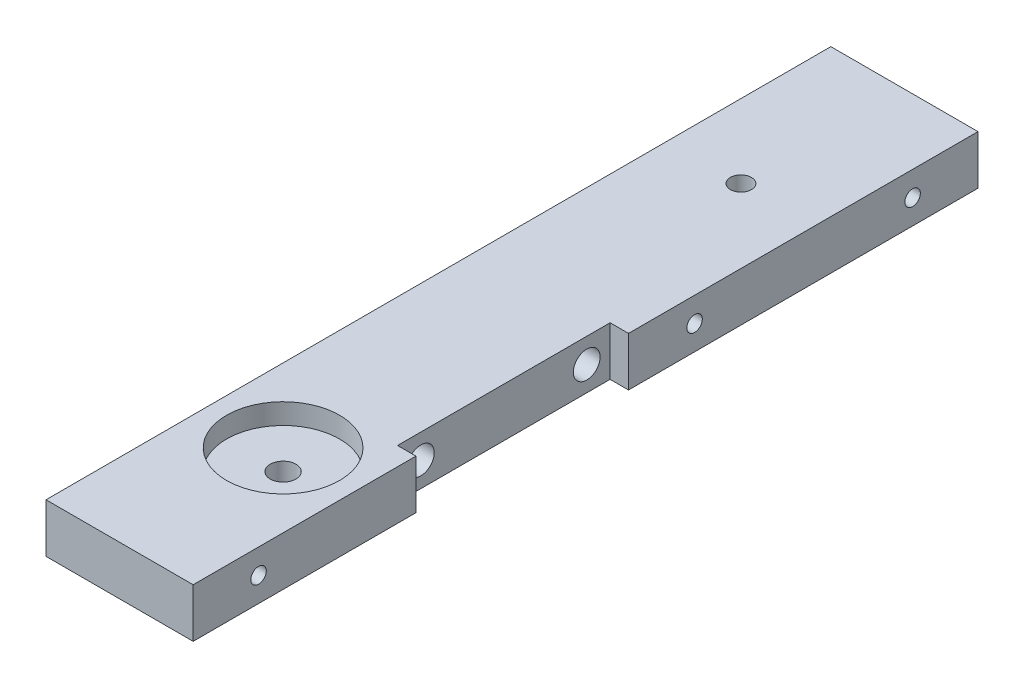
ISO-10303-21;
HEADER;
FILE_DESCRIPTION(('STEP AP214'),'2;1');
FILE_NAME('part.step','',(''),(''),'','','');
FILE_SCHEMA(('AUTOMOTIVE_DESIGN { 1 0 10303 214 1 1 1 1 }'));
ENDSEC;
DATA;
#1=APPLICATION_CONTEXT('core data for automotive mechanical design processes');
#2=APPLICATION_PROTOCOL_DEFINITION('international standard','automotive_design',2000,#1);
#3=PRODUCT_CONTEXT('',#1,'mechanical');
#4=PRODUCT('Part','Part','',(#3));
#5=PRODUCT_RELATED_PRODUCT_CATEGORY('part','',(#4));
#6=PRODUCT_DEFINITION_FORMATION('','',#4);
#7=PRODUCT_DEFINITION_CONTEXT('part definition',#1,'design');
#8=PRODUCT_DEFINITION('design','',#6,#7);
#9=PRODUCT_DEFINITION_SHAPE('','',#8);
#10=(LENGTH_UNIT() NAMED_UNIT(*) SI_UNIT(.MILLI.,.METRE.));
#11=(NAMED_UNIT(*) PLANE_ANGLE_UNIT() SI_UNIT($,.RADIAN.));
#12=(NAMED_UNIT(*) SI_UNIT($,.STERADIAN.) SOLID_ANGLE_UNIT());
#13=UNCERTAINTY_MEASURE_WITH_UNIT(LENGTH_MEASURE(1.E-05),#10,'distance_accuracy_value','');
#14=(GEOMETRIC_REPRESENTATION_CONTEXT(3) GLOBAL_UNCERTAINTY_ASSIGNED_CONTEXT((#13)) GLOBAL_UNIT_ASSIGNED_CONTEXT((#10,
#11,#12)) REPRESENTATION_CONTEXT('',''));
#15=CARTESIAN_POINT('',(0.,0.,0.));
#16=DIRECTION('',(0.,0.,1.));
#17=DIRECTION('',(1.,0.,0.));
#18=AXIS2_PLACEMENT_3D('',#15,#16,#17);
#19=CARTESIAN_POINT('',(28.575,9.525,-152.4));
#20=DIRECTION('',(-1.,0.,0.));
#21=DIRECTION('',(0.,0.,1.));
#22=AXIS2_PLACEMENT_3D('',#19,#20,#21);
#23=PLANE('',#22);
#24=CARTESIAN_POINT('',(28.575,4.7625,-12.7));
#25=DIRECTION('',(-1.,0.,0.));
#26=DIRECTION('',(0.,0.,1.));
#27=AXIS2_PLACEMENT_3D('',#24,#25,#26);
#28=CIRCLE('',#27,1.49999999999999);
#29=CARTESIAN_POINT('',(28.575,4.7625,-11.2));
#30=VERTEX_POINT('',#29);
#31=EDGE_CURVE('E49',#30,#30,#28,.T.);
#32=ORIENTED_EDGE('',*,*,#31,.T.);
#33=EDGE_LOOP('',(#32));
#34=FACE_BOUND('',#33,.T.);
#35=DIRECTION('',(0.,1.,0.));
#36=VECTOR('',#35,1.);
#37=CARTESIAN_POINT('',(28.575,9.525,-43.255));
#38=LINE('',#37,#36);
#39=CARTESIAN_POINT('',(28.575,0.,-43.255));
#40=VERTEX_POINT('',#39);
#41=CARTESIAN_POINT('',(28.575,9.525,-43.255));
#42=VERTEX_POINT('',#41);
#43=EDGE_CURVE('E137',#40,#42,#38,.T.);
#44=ORIENTED_EDGE('',*,*,#43,.T.);
#45=DIRECTION('',(0.,0.,-1.));
#46=VECTOR('',#45,1.);
#47=CARTESIAN_POINT('',(28.575,9.525,-152.4));
#48=LINE('',#47,#46);
#49=CARTESIAN_POINT('',(28.575,9.525,0.));
#50=VERTEX_POINT('',#49);
#51=EDGE_CURVE('E94',#50,#42,#48,.T.);
#52=ORIENTED_EDGE('',*,*,#51,.F.);
#53=DIRECTION('',(0.,-1.,0.));
#54=VECTOR('',#53,1.);
#55=CARTESIAN_POINT('',(28.575,9.525,0.));
#56=LINE('',#55,#54);
#57=CARTESIAN_POINT('',(28.575,0.,0.));
#58=VERTEX_POINT('',#57);
#59=EDGE_CURVE('E160',#50,#58,#56,.T.);
#60=ORIENTED_EDGE('',*,*,#59,.T.);
#61=DIRECTION('',(0.,0.,-1.));
#62=VECTOR('',#61,1.);
#63=CARTESIAN_POINT('',(28.575,0.,-152.4));
#64=LINE('',#63,#62);
#65=EDGE_CURVE('E142',#58,#40,#64,.T.);
#66=ORIENTED_EDGE('',*,*,#65,.T.);
#67=EDGE_LOOP('',(#44,#52,#60,#66));
#68=FACE_BOUND('',#67,.T.);
#69=ADVANCED_FACE('F40',(#34,#68),#23,.F.);
#70=CARTESIAN_POINT('',(28.575,4.7625,-139.7));
#71=DIRECTION('',(-1.,0.,0.));
#72=DIRECTION('',(0.,0.,1.));
#73=AXIS2_PLACEMENT_3D('',#70,#71,#72);
#74=CIRCLE('',#73,1.49999999999999);
#75=CARTESIAN_POINT('',(28.575,4.7625,-138.2));
#76=VERTEX_POINT('',#75);
#77=EDGE_CURVE('E147',#76,#76,#74,.T.);
#78=ORIENTED_EDGE('',*,*,#77,.T.);
#79=EDGE_LOOP('',(#78));
#80=FACE_BOUND('',#79,.T.);
#81=CARTESIAN_POINT('',(28.575,4.7625,-97.3666666666667));
#82=DIRECTION('',(-1.,0.,0.));
#83=DIRECTION('',(0.,0.,1.));
#84=AXIS2_PLACEMENT_3D('',#81,#82,#83);
#85=CIRCLE('',#84,1.49999999999999);
#86=CARTESIAN_POINT('',(28.575,4.7625,-95.8666666666667));
#87=VERTEX_POINT('',#86);
#88=EDGE_CURVE('E225',#87,#87,#85,.T.);
#89=ORIENTED_EDGE('',*,*,#88,.T.);
#90=EDGE_LOOP('',(#89));
#91=FACE_BOUND('',#90,.T.);
#92=DIRECTION('',(0.,-1.,0.));
#93=VECTOR('',#92,1.);
#94=CARTESIAN_POINT('',(28.575,9.525,-84.535));
#95=LINE('',#94,#93);
#96=CARTESIAN_POINT('',(28.575,9.525,-84.535));
#97=VERTEX_POINT('',#96);
#98=CARTESIAN_POINT('',(28.575,0.,-84.535));
#99=VERTEX_POINT('',#98);
#100=EDGE_CURVE('E121',#97,#99,#95,.T.);
#101=ORIENTED_EDGE('',*,*,#100,.T.);
#102=CARTESIAN_POINT('',(28.575,0.,-152.4));
#103=VERTEX_POINT('',#102);
#104=EDGE_CURVE('E134',#99,#103,#64,.T.);
#105=ORIENTED_EDGE('',*,*,#104,.T.);
#106=DIRECTION('',(0.,-1.,0.));
#107=VECTOR('',#106,1.);
#108=CARTESIAN_POINT('',(28.575,9.525,-152.4));
#109=LINE('',#108,#107);
#110=CARTESIAN_POINT('',(28.575,9.525,-152.4));
#111=VERTEX_POINT('',#110);
#112=EDGE_CURVE('E158',#111,#103,#109,.T.);
#113=ORIENTED_EDGE('',*,*,#112,.F.);
#114=EDGE_CURVE('E136',#97,#111,#48,.T.);
#115=ORIENTED_EDGE('',*,*,#114,.F.);
#116=EDGE_LOOP('',(#101,#105,#113,#115));
#117=FACE_BOUND('',#116,.T.);
#118=ADVANCED_FACE('F132',(#80,#91,#117),#23,.F.);
#119=CARTESIAN_POINT('',(0.,9.525,0.));
#120=DIRECTION('',(0.,-1.,0.));
#121=DIRECTION('',(0.,0.,-1.));
#122=AXIS2_PLACEMENT_3D('',#119,#120,#121);
#123=PLANE('',#122);
#124=CARTESIAN_POINT('',(14.2875,9.525,-120.65));
#125=DIRECTION('',(0.,1.,0.));
#126=DIRECTION('',(0.,0.,1.));
#127=AXIS2_PLACEMENT_3D('',#124,#125,#126);
#128=CIRCLE('',#127,2.05);
#129=CARTESIAN_POINT('',(14.2875,9.525,-118.6));
#130=VERTEX_POINT('',#129);
#131=EDGE_CURVE('E229',#130,#130,#128,.T.);
#132=ORIENTED_EDGE('',*,*,#131,.F.);
#133=EDGE_LOOP('',(#132));
#134=FACE_BOUND('',#133,.T.);
#135=CARTESIAN_POINT('',(14.2875,9.525,-31.75));
#136=DIRECTION('',(0.,1.,0.));
#137=DIRECTION('',(0.,0.,1.));
#138=AXIS2_PLACEMENT_3D('',#135,#136,#137);
#139=CIRCLE('',#138,10.975);
#140=CARTESIAN_POINT('',(14.2875,9.525,-20.775));
#141=VERTEX_POINT('',#140);
#142=EDGE_CURVE('E235',#141,#141,#139,.T.);
#143=ORIENTED_EDGE('',*,*,#142,.F.);
#144=EDGE_LOOP('',(#143));
#145=FACE_BOUND('',#144,.T.);
#146=DIRECTION('',(1.,0.,0.));
#147=VECTOR('',#146,1.);
#148=CARTESIAN_POINT('',(-42.3646553744982,9.525,-43.255));
#149=LINE('',#148,#147);
#150=CARTESIAN_POINT('',(25.,9.525,-43.255));
#151=VERTEX_POINT('',#150);
#152=EDGE_CURVE('E211',#151,#42,#149,.T.);
#153=ORIENTED_EDGE('',*,*,#152,.F.);
#154=DIRECTION('',(0.,0.,1.));
#155=VECTOR('',#154,1.);
#156=CARTESIAN_POINT('',(25.,9.525,-84.535));
#157=LINE('',#156,#155);
#158=CARTESIAN_POINT('',(25.,9.525,-84.535));
#159=VERTEX_POINT('',#158);
#160=EDGE_CURVE('E127',#159,#151,#157,.T.);
#161=ORIENTED_EDGE('',*,*,#160,.F.);
#162=DIRECTION('',(1.,0.,0.));
#163=VECTOR('',#162,1.);
#164=CARTESIAN_POINT('',(-42.3646553744982,9.525,-84.535));
#165=LINE('',#164,#163);
#166=EDGE_CURVE('E207',#159,#97,#165,.T.);
#167=ORIENTED_EDGE('',*,*,#166,.T.);
#168=ORIENTED_EDGE('',*,*,#114,.T.);
#169=DIRECTION('',(-1.,0.,0.));
#170=VECTOR('',#169,1.);
#171=CARTESIAN_POINT('',(0.,9.525,-152.4));
#172=LINE('',#171,#170);
#173=CARTESIAN_POINT('',(0.,9.525,-152.4));
#174=VERTEX_POINT('',#173);
#175=EDGE_CURVE('E212',#111,#174,#172,.T.);
#176=ORIENTED_EDGE('',*,*,#175,.T.);
#177=DIRECTION('',(0.,0.,1.));
#178=VECTOR('',#177,1.);
#179=CARTESIAN_POINT('',(0.,9.525,0.));
#180=LINE('',#179,#178);
#181=CARTESIAN_POINT('',(0.,9.525,0.));
#182=VERTEX_POINT('',#181);
#183=EDGE_CURVE('E65',#174,#182,#180,.T.);
#184=ORIENTED_EDGE('',*,*,#183,.T.);
#185=DIRECTION('',(1.,0.,0.));
#186=VECTOR('',#185,1.);
#187=CARTESIAN_POINT('',(28.575,9.525,0.));
#188=LINE('',#187,#186);
#189=EDGE_CURVE('E153',#182,#50,#188,.T.);
#190=ORIENTED_EDGE('',*,*,#189,.T.);
#191=ORIENTED_EDGE('',*,*,#51,.T.);
#192=EDGE_LOOP('',(#153,#161,#167,#168,#176,#184,#190,#191));
#193=FACE_BOUND('',#192,.T.);
#194=ADVANCED_FACE('F196',(#134,#145,#193),#123,.F.);
#195=CARTESIAN_POINT('',(0.,0.,0.));
#196=DIRECTION('',(0.,-1.,0.));
#197=DIRECTION('',(0.,0.,-1.));
#198=AXIS2_PLACEMENT_3D('',#195,#196,#197);
#199=PLANE('',#198);
#200=CARTESIAN_POINT('',(14.2875,0.,-31.75));
#201=DIRECTION('',(0.,1.,0.));
#202=DIRECTION('',(0.,0.,1.));
#203=AXIS2_PLACEMENT_3D('',#200,#201,#202);
#204=CIRCLE('',#203,2.5);
#205=CARTESIAN_POINT('',(14.2875,0.,-29.25));
#206=VERTEX_POINT('',#205);
#207=EDGE_CURVE('E238',#206,#206,#204,.T.);
#208=ORIENTED_EDGE('',*,*,#207,.T.);
#209=EDGE_LOOP('',(#208));
#210=FACE_BOUND('',#209,.T.);
#211=CARTESIAN_POINT('',(14.2875,0.,-120.65));
#212=DIRECTION('',(0.,1.,0.));
#213=DIRECTION('',(0.,0.,1.));
#214=AXIS2_PLACEMENT_3D('',#211,#212,#213);
#215=CIRCLE('',#214,2.05);
#216=CARTESIAN_POINT('',(14.2875,0.,-118.6));
#217=VERTEX_POINT('',#216);
#218=EDGE_CURVE('E228',#217,#217,#215,.T.);
#219=ORIENTED_EDGE('',*,*,#218,.T.);
#220=EDGE_LOOP('',(#219));
#221=FACE_BOUND('',#220,.T.);
#222=DIRECTION('',(0.,0.,-1.));
#223=VECTOR('',#222,1.);
#224=CARTESIAN_POINT('',(25.,0.,-84.535));
#225=LINE('',#224,#223);
#226=CARTESIAN_POINT('',(25.,0.,-43.255));
#227=VERTEX_POINT('',#226);
#228=CARTESIAN_POINT('',(25.,0.,-84.535));
#229=VERTEX_POINT('',#228);
#230=EDGE_CURVE('E260',#227,#229,#225,.T.);
#231=ORIENTED_EDGE('',*,*,#230,.F.);
#232=DIRECTION('',(1.,0.,0.));
#233=VECTOR('',#232,1.);
#234=CARTESIAN_POINT('',(-42.3646553744982,0.,-43.255));
#235=LINE('',#234,#233);
#236=EDGE_CURVE('E128',#227,#40,#235,.T.);
#237=ORIENTED_EDGE('',*,*,#236,.T.);
#238=ORIENTED_EDGE('',*,*,#65,.F.);
#239=DIRECTION('',(1.,0.,0.));
#240=VECTOR('',#239,1.);
#241=CARTESIAN_POINT('',(28.575,0.,0.));
#242=LINE('',#241,#240);
#243=CARTESIAN_POINT('',(0.,0.,0.));
#244=VERTEX_POINT('',#243);
#245=EDGE_CURVE('E143',#244,#58,#242,.T.);
#246=ORIENTED_EDGE('',*,*,#245,.F.);
#247=DIRECTION('',(0.,0.,1.));
#248=VECTOR('',#247,1.);
#249=CARTESIAN_POINT('',(0.,0.,0.));
#250=LINE('',#249,#248);
#251=CARTESIAN_POINT('',(0.,0.,-152.4));
#252=VERTEX_POINT('',#251);
#253=EDGE_CURVE('E86',#252,#244,#250,.T.);
#254=ORIENTED_EDGE('',*,*,#253,.F.);
#255=DIRECTION('',(-1.,0.,0.));
#256=VECTOR('',#255,1.);
#257=CARTESIAN_POINT('',(0.,0.,-152.4));
#258=LINE('',#257,#256);
#259=EDGE_CURVE('E141',#103,#252,#258,.T.);
#260=ORIENTED_EDGE('',*,*,#259,.F.);
#261=ORIENTED_EDGE('',*,*,#104,.F.);
#262=DIRECTION('',(1.,0.,0.));
#263=VECTOR('',#262,1.);
#264=CARTESIAN_POINT('',(-42.3646553744982,0.,-84.535));
#265=LINE('',#264,#263);
#266=EDGE_CURVE('E117',#229,#99,#265,.T.);
#267=ORIENTED_EDGE('',*,*,#266,.F.);
#268=EDGE_LOOP('',(#231,#237,#238,#246,#254,#260,#261,#267));
#269=FACE_BOUND('',#268,.T.);
#270=ADVANCED_FACE('F140',(#210,#221,#269),#199,.T.);
#271=CARTESIAN_POINT('',(28.575,4.7625,-47.79));
#272=DIRECTION('',(-1.,0.,0.));
#273=DIRECTION('',(0.,0.,1.));
#274=AXIS2_PLACEMENT_3D('',#271,#272,#273);
#275=CYLINDRICAL_SURFACE('',#274,2.6);
#276=CARTESIAN_POINT('',(0.,4.7625,-47.79));
#277=DIRECTION('',(-1.,0.,0.));
#278=DIRECTION('',(0.,0.,1.));
#279=AXIS2_PLACEMENT_3D('',#276,#277,#278);
#280=CIRCLE('',#279,2.6);
#281=CARTESIAN_POINT('',(0.,4.7625,-45.19));
#282=VERTEX_POINT('',#281);
#283=EDGE_CURVE('E247',#282,#282,#280,.T.);
#284=ORIENTED_EDGE('',*,*,#283,.T.);
#285=EDGE_LOOP('',(#284));
#286=FACE_BOUND('',#285,.T.);
#287=CARTESIAN_POINT('',(25.,4.7625,-47.79));
#288=DIRECTION('',(1.,0.,0.));
#289=DIRECTION('',(0.,0.,-1.));
#290=AXIS2_PLACEMENT_3D('',#287,#288,#289);
#291=CIRCLE('',#290,2.6);
#292=CARTESIAN_POINT('',(25.,4.7625,-50.39));
#293=VERTEX_POINT('',#292);
#294=EDGE_CURVE('E250',#293,#293,#291,.F.);
#295=ORIENTED_EDGE('',*,*,#294,.F.);
#296=EDGE_LOOP('',(#295));
#297=FACE_BOUND('',#296,.T.);
#298=ADVANCED_FACE('F275',(#286,#297),#275,.F.);
#299=CARTESIAN_POINT('',(28.575,4.7625,-80.));
#300=DIRECTION('',(-1.,0.,0.));
#301=DIRECTION('',(0.,0.,1.));
#302=AXIS2_PLACEMENT_3D('',#299,#300,#301);
#303=CYLINDRICAL_SURFACE('',#302,2.6);
#304=CARTESIAN_POINT('',(0.,4.7625,-80.));
#305=DIRECTION('',(-1.,0.,0.));
#306=DIRECTION('',(0.,0.,1.));
#307=AXIS2_PLACEMENT_3D('',#304,#305,#306);
#308=CIRCLE('',#307,2.6);
#309=CARTESIAN_POINT('',(0.,4.7625,-77.4));
#310=VERTEX_POINT('',#309);
#311=EDGE_CURVE('E244',#310,#310,#308,.T.);
#312=ORIENTED_EDGE('',*,*,#311,.T.);
#313=EDGE_LOOP('',(#312));
#314=FACE_BOUND('',#313,.T.);
#315=CARTESIAN_POINT('',(25.,4.7625,-80.));
#316=DIRECTION('',(1.,0.,0.));
#317=DIRECTION('',(0.,0.,-1.));
#318=AXIS2_PLACEMENT_3D('',#315,#316,#317);
#319=CIRCLE('',#318,2.6);
#320=CARTESIAN_POINT('',(25.,4.7625,-82.6));
#321=VERTEX_POINT('',#320);
#322=EDGE_CURVE('E44',#321,#321,#319,.F.);
#323=ORIENTED_EDGE('',*,*,#322,.F.);
#324=EDGE_LOOP('',(#323));
#325=FACE_BOUND('',#324,.T.);
#326=ADVANCED_FACE('F169',(#314,#325),#303,.F.);
#327=CARTESIAN_POINT('',(0.,4.7625,-12.7));
#328=DIRECTION('',(-1.,0.,0.));
#329=DIRECTION('',(0.,0.,1.));
#330=AXIS2_PLACEMENT_3D('',#327,#328,#329);
#331=CYLINDRICAL_SURFACE('',#330,1.5);
#332=ORIENTED_EDGE('',*,*,#31,.F.);
#333=EDGE_LOOP('',(#332));
#334=FACE_BOUND('',#333,.T.);
#335=CARTESIAN_POINT('',(0.,4.7625,-12.7));
#336=DIRECTION('',(-1.,0.,0.));
#337=DIRECTION('',(0.,0.,1.));
#338=AXIS2_PLACEMENT_3D('',#335,#336,#337);
#339=CIRCLE('',#338,1.5);
#340=CARTESIAN_POINT('',(0.,4.7625,-11.2));
#341=VERTEX_POINT('',#340);
#342=EDGE_CURVE('E12',#341,#341,#339,.T.);
#343=ORIENTED_EDGE('',*,*,#342,.T.);
#344=EDGE_LOOP('',(#343));
#345=FACE_BOUND('',#344,.T.);
#346=ADVANCED_FACE('F42',(#334,#345),#331,.F.);
#347=CARTESIAN_POINT('',(28.575,9.525,0.));
#348=DIRECTION('',(0.,0.,-1.));
#349=DIRECTION('',(-1.,0.,0.));
#350=AXIS2_PLACEMENT_3D('',#347,#348,#349);
#351=PLANE('',#350);
#352=ORIENTED_EDGE('',*,*,#245,.T.);
#353=ORIENTED_EDGE('',*,*,#59,.F.);
#354=ORIENTED_EDGE('',*,*,#189,.F.);
#355=DIRECTION('',(0.,-1.,0.));
#356=VECTOR('',#355,1.);
#357=CARTESIAN_POINT('',(0.,9.525,0.));
#358=LINE('',#357,#356);
#359=EDGE_CURVE('E154',#182,#244,#358,.T.);
#360=ORIENTED_EDGE('',*,*,#359,.T.);
#361=EDGE_LOOP('',(#352,#353,#354,#360));
#362=FACE_BOUND('',#361,.T.);
#363=ADVANCED_FACE('F168',(#362),#351,.F.);
#364=CARTESIAN_POINT('',(0.,9.525,-152.4));
#365=DIRECTION('',(0.,0.,1.));
#366=DIRECTION('',(1.,0.,0.));
#367=AXIS2_PLACEMENT_3D('',#364,#365,#366);
#368=PLANE('',#367);
#369=ORIENTED_EDGE('',*,*,#259,.T.);
#370=DIRECTION('',(0.,-1.,0.));
#371=VECTOR('',#370,1.);
#372=CARTESIAN_POINT('',(0.,9.525,-152.4));
#373=LINE('',#372,#371);
#374=EDGE_CURVE('E156',#174,#252,#373,.T.);
#375=ORIENTED_EDGE('',*,*,#374,.F.);
#376=ORIENTED_EDGE('',*,*,#175,.F.);
#377=ORIENTED_EDGE('',*,*,#112,.T.);
#378=EDGE_LOOP('',(#369,#375,#376,#377));
#379=FACE_BOUND('',#378,.T.);
#380=ADVANCED_FACE('F175',(#379),#368,.F.);
#381=CARTESIAN_POINT('',(0.,9.525,0.));
#382=DIRECTION('',(1.,0.,0.));
#383=DIRECTION('',(0.,0.,-1.));
#384=AXIS2_PLACEMENT_3D('',#381,#382,#383);
#385=PLANE('',#384);
#386=ORIENTED_EDGE('',*,*,#311,.F.);
#387=EDGE_LOOP('',(#386));
#388=FACE_BOUND('',#387,.T.);
#389=ORIENTED_EDGE('',*,*,#283,.F.);
#390=EDGE_LOOP('',(#389));
#391=FACE_BOUND('',#390,.T.);
#392=CARTESIAN_POINT('',(0.,4.7625,-97.3666666666667));
#393=DIRECTION('',(-1.,0.,0.));
#394=DIRECTION('',(0.,0.,1.));
#395=AXIS2_PLACEMENT_3D('',#392,#393,#394);
#396=CIRCLE('',#395,1.5);
#397=CARTESIAN_POINT('',(0.,4.7625,-95.8666666666667));
#398=VERTEX_POINT('',#397);
#399=EDGE_CURVE('E222',#398,#398,#396,.T.);
#400=ORIENTED_EDGE('',*,*,#399,.F.);
#401=EDGE_LOOP('',(#400));
#402=FACE_BOUND('',#401,.T.);
#403=CARTESIAN_POINT('',(0.,4.7625,-139.7));
#404=DIRECTION('',(-1.,0.,0.));
#405=DIRECTION('',(0.,0.,1.));
#406=AXIS2_PLACEMENT_3D('',#403,#404,#405);
#407=CIRCLE('',#406,1.5);
#408=CARTESIAN_POINT('',(0.,4.7625,-138.2));
#409=VERTEX_POINT('',#408);
#410=EDGE_CURVE('E219',#409,#409,#407,.T.);
#411=ORIENTED_EDGE('',*,*,#410,.F.);
#412=EDGE_LOOP('',(#411));
#413=FACE_BOUND('',#412,.T.);
#414=ORIENTED_EDGE('',*,*,#253,.T.);
#415=ORIENTED_EDGE('',*,*,#359,.F.);
#416=ORIENTED_EDGE('',*,*,#183,.F.);
#417=ORIENTED_EDGE('',*,*,#374,.T.);
#418=EDGE_LOOP('',(#414,#415,#416,#417));
#419=FACE_BOUND('',#418,.T.);
#420=ORIENTED_EDGE('',*,*,#342,.F.);
#421=EDGE_LOOP('',(#420));
#422=FACE_BOUND('',#421,.T.);
#423=ADVANCED_FACE('F172',(#388,#391,#402,#413,#419,#422),#385,.F.);
#424=CARTESIAN_POINT('',(0.,4.7625,-139.7));
#425=DIRECTION('',(-1.,0.,0.));
#426=DIRECTION('',(0.,0.,1.));
#427=AXIS2_PLACEMENT_3D('',#424,#425,#426);
#428=CYLINDRICAL_SURFACE('',#427,1.5);
#429=ORIENTED_EDGE('',*,*,#77,.F.);
#430=EDGE_LOOP('',(#429));
#431=FACE_BOUND('',#430,.T.);
#432=ORIENTED_EDGE('',*,*,#410,.T.);
#433=EDGE_LOOP('',(#432));
#434=FACE_BOUND('',#433,.T.);
#435=ADVANCED_FACE('F174',(#431,#434),#428,.F.);
#436=CARTESIAN_POINT('',(0.,4.7625,-97.3666666666667));
#437=DIRECTION('',(-1.,0.,0.));
#438=DIRECTION('',(0.,0.,1.));
#439=AXIS2_PLACEMENT_3D('',#436,#437,#438);
#440=CYLINDRICAL_SURFACE('',#439,1.5);
#441=ORIENTED_EDGE('',*,*,#88,.F.);
#442=EDGE_LOOP('',(#441));
#443=FACE_BOUND('',#442,.T.);
#444=ORIENTED_EDGE('',*,*,#399,.T.);
#445=EDGE_LOOP('',(#444));
#446=FACE_BOUND('',#445,.T.);
#447=ADVANCED_FACE('F183',(#443,#446),#440,.F.);
#448=CARTESIAN_POINT('',(14.2875,0.,-120.65));
#449=DIRECTION('',(0.,1.,0.));
#450=DIRECTION('',(0.,0.,1.));
#451=AXIS2_PLACEMENT_3D('',#448,#449,#450);
#452=CYLINDRICAL_SURFACE('',#451,2.05);
#453=CARTESIAN_POINT('',(14.2875,0.,-118.6));
#454=CARTESIAN_POINT('',(14.2875,0.0992187499999999,-118.6));
#455=CARTESIAN_POINT('',(14.2875,0.1984375,-118.6));
#456=CARTESIAN_POINT('',(14.2875,0.396875,-118.6));
#457=CARTESIAN_POINT('',(14.2875,0.49609375,-118.6));
#458=CARTESIAN_POINT('',(14.2875,0.69453125,-118.6));
#459=CARTESIAN_POINT('',(14.2875,0.79375,-118.6));
#460=CARTESIAN_POINT('',(14.2875,0.9921875,-118.6));
#461=CARTESIAN_POINT('',(14.2875,1.09140625,-118.6));
#462=CARTESIAN_POINT('',(14.2875,1.28984375,-118.6));
#463=CARTESIAN_POINT('',(14.2875,1.3890625,-118.6));
#464=CARTESIAN_POINT('',(14.2875,1.5875,-118.6));
#465=CARTESIAN_POINT('',(14.2875,1.68671875,-118.6));
#466=CARTESIAN_POINT('',(14.2875,1.88515625,-118.6));
#467=CARTESIAN_POINT('',(14.2875,1.984375,-118.6));
#468=CARTESIAN_POINT('',(14.2875,2.1828125,-118.6));
#469=CARTESIAN_POINT('',(14.2875,2.28203125,-118.6));
#470=CARTESIAN_POINT('',(14.2875,2.48046875,-118.6));
#471=CARTESIAN_POINT('',(14.2875,2.5796875,-118.6));
#472=CARTESIAN_POINT('',(14.2875,2.778125,-118.6));
#473=CARTESIAN_POINT('',(14.2875,2.87734375,-118.6));
#474=CARTESIAN_POINT('',(14.2875,3.07578125,-118.6));
#475=CARTESIAN_POINT('',(14.2875,3.175,-118.6));
#476=CARTESIAN_POINT('',(14.2875,3.3734375,-118.6));
#477=CARTESIAN_POINT('',(14.2875,3.47265625,-118.6));
#478=CARTESIAN_POINT('',(14.2875,3.67109375,-118.6));
#479=CARTESIAN_POINT('',(14.2875,3.7703125,-118.6));
#480=CARTESIAN_POINT('',(14.2875,3.96875,-118.6));
#481=CARTESIAN_POINT('',(14.2875,4.06796875,-118.6));
#482=CARTESIAN_POINT('',(14.2875,4.26640625,-118.6));
#483=CARTESIAN_POINT('',(14.2875,4.365625,-118.6));
#484=CARTESIAN_POINT('',(14.2875,4.5640625,-118.6));
#485=CARTESIAN_POINT('',(14.2875,4.66328125,-118.6));
#486=CARTESIAN_POINT('',(14.2875,4.86171875,-118.6));
#487=CARTESIAN_POINT('',(14.2875,4.9609375,-118.6));
#488=CARTESIAN_POINT('',(14.2875,5.159375,-118.6));
#489=CARTESIAN_POINT('',(14.2875,5.25859375,-118.6));
#490=CARTESIAN_POINT('',(14.2875,5.45703125,-118.6));
#491=CARTESIAN_POINT('',(14.2875,5.55625,-118.6));
#492=CARTESIAN_POINT('',(14.2875,5.7546875,-118.6));
#493=CARTESIAN_POINT('',(14.2875,5.85390625,-118.6));
#494=CARTESIAN_POINT('',(14.2875,6.05234375,-118.6));
#495=CARTESIAN_POINT('',(14.2875,6.1515625,-118.6));
#496=CARTESIAN_POINT('',(14.2875,6.35,-118.6));
#497=CARTESIAN_POINT('',(14.2875,6.44921875,-118.6));
#498=CARTESIAN_POINT('',(14.2875,6.64765625,-118.6));
#499=CARTESIAN_POINT('',(14.2875,6.746875,-118.6));
#500=CARTESIAN_POINT('',(14.2875,6.9453125,-118.6));
#501=CARTESIAN_POINT('',(14.2875,7.04453125,-118.6));
#502=CARTESIAN_POINT('',(14.2875,7.24296875,-118.6));
#503=CARTESIAN_POINT('',(14.2875,7.3421875,-118.6));
#504=CARTESIAN_POINT('',(14.2875,7.540625,-118.6));
#505=CARTESIAN_POINT('',(14.2875,7.63984375,-118.6));
#506=CARTESIAN_POINT('',(14.2875,7.83828125,-118.6));
#507=CARTESIAN_POINT('',(14.2875,7.9375,-118.6));
#508=CARTESIAN_POINT('',(14.2875,8.1359375,-118.6));
#509=CARTESIAN_POINT('',(14.2875,8.23515625,-118.6));
#510=CARTESIAN_POINT('',(14.2875,8.43359375,-118.6));
#511=CARTESIAN_POINT('',(14.2875,8.5328125,-118.6));
#512=CARTESIAN_POINT('',(14.2875,8.73125,-118.6));
#513=CARTESIAN_POINT('',(14.2875,8.83046875,-118.6));
#514=CARTESIAN_POINT('',(14.2875,9.02890625,-118.6));
#515=CARTESIAN_POINT('',(14.2875,9.128125,-118.6));
#516=CARTESIAN_POINT('',(14.2875,9.3265625,-118.6));
#517=CARTESIAN_POINT('',(14.2875,9.42578125,-118.6));
#518=CARTESIAN_POINT('',(14.2875,9.525,-118.6));
#519=B_SPLINE_CURVE_WITH_KNOTS('',3,(#453,#454,#455,#456,#457,#458,#459,#460,#461,#462,#463,
#464,#465,#466,#467,#468,#469,#470,#471,#472,#473,#474,#475,#476,#477,#478,#479,#480,#481,#482,
#483,#484,#485,#486,#487,#488,#489,#490,#491,#492,#493,#494,#495,#496,#497,#498,#499,#500,#501,
#502,#503,#504,#505,#506,#507,#508,#509,#510,#511,#512,#513,#514,#515,#516,#517,#518),
.UNSPECIFIED.,.F.,.F.,(4,2,2,2,2,2,2,2,2,2,2,2,2,2,2,2,2,2,2,2,2,2,2,2,2,2,2,2,2,2,2,2,4),(0.,
0.29765625,0.5953125,0.89296875,1.190625,1.48828125,1.7859375,2.08359375,2.38125,2.67890625,
2.9765625,3.27421875,3.571875,3.86953125,4.1671875,4.46484375,4.7625,5.06015625,5.3578125,
5.65546875,5.953125,6.25078125,6.5484375,6.84609375,7.14375,7.44140625,7.7390625,8.03671875,
8.334375,8.63203125,8.9296875,9.22734375,9.525),.UNSPECIFIED.);
#520=EDGE_CURVE('BSEAM297',#217,#130,#519,.T.);
#521=ORIENTED_EDGE('',*,*,#218,.F.);
#522=ORIENTED_EDGE('',*,*,#131,.T.);
#523=ORIENTED_EDGE('',*,*,#520,.T.);
#524=ORIENTED_EDGE('',*,*,#520,.F.);
#525=EDGE_LOOP('',(#521,#523,#522,#524));
#526=FACE_BOUND('',#525,.T.);
#527=ADVANCED_FACE('F297',(#526),#452,.F.);
#528=CARTESIAN_POINT('',(14.2875,5.525,-31.75));
#529=DIRECTION('',(0.,1.,0.));
#530=DIRECTION('',(0.,0.,1.));
#531=AXIS2_PLACEMENT_3D('',#528,#529,#530);
#532=CYLINDRICAL_SURFACE('',#531,10.975);
#533=CARTESIAN_POINT('',(14.2875,5.525,-31.75));
#534=DIRECTION('',(0.,1.,0.));
#535=DIRECTION('',(0.,0.,1.));
#536=AXIS2_PLACEMENT_3D('',#533,#534,#535);
#537=CIRCLE('',#536,10.975);
#538=CARTESIAN_POINT('',(14.2875,5.525,-20.775));
#539=VERTEX_POINT('',#538);
#540=EDGE_CURVE('E232',#539,#539,#537,.T.);
#541=ORIENTED_EDGE('',*,*,#540,.F.);
#542=EDGE_LOOP('',(#541));
#543=FACE_BOUND('',#542,.T.);
#544=ORIENTED_EDGE('',*,*,#142,.T.);
#545=EDGE_LOOP('',(#544));
#546=FACE_BOUND('',#545,.T.);
#547=ADVANCED_FACE('F293',(#543,#546),#532,.F.);
#548=CARTESIAN_POINT('',(14.2875,5.525,-31.75));
#549=DIRECTION('',(0.,1.,0.));
#550=DIRECTION('',(0.,0.,1.));
#551=AXIS2_PLACEMENT_3D('',#548,#549,#550);
#552=PLANE('',#551);
#553=CARTESIAN_POINT('',(14.2875,5.525,-31.75));
#554=DIRECTION('',(0.,1.,0.));
#555=DIRECTION('',(0.,0.,1.));
#556=AXIS2_PLACEMENT_3D('',#553,#554,#555);
#557=CIRCLE('',#556,2.5);
#558=CARTESIAN_POINT('',(14.2875,5.525,-29.25));
#559=VERTEX_POINT('',#558);
#560=EDGE_CURVE('E241',#559,#559,#557,.T.);
#561=ORIENTED_EDGE('',*,*,#560,.F.);
#562=EDGE_LOOP('',(#561));
#563=FACE_BOUND('',#562,.T.);
#564=ORIENTED_EDGE('',*,*,#540,.T.);
#565=EDGE_LOOP('',(#564));
#566=FACE_BOUND('',#565,.T.);
#567=ADVANCED_FACE('F289',(#563,#566),#552,.T.);
#568=CARTESIAN_POINT('',(14.2875,0.,-31.75));
#569=DIRECTION('',(0.,1.,0.));
#570=DIRECTION('',(0.,0.,1.));
#571=AXIS2_PLACEMENT_3D('',#568,#569,#570);
#572=CYLINDRICAL_SURFACE('',#571,2.5);
#573=ORIENTED_EDGE('',*,*,#207,.F.);
#574=EDGE_LOOP('',(#573));
#575=FACE_BOUND('',#574,.T.);
#576=ORIENTED_EDGE('',*,*,#560,.T.);
#577=EDGE_LOOP('',(#576));
#578=FACE_BOUND('',#577,.T.);
#579=ADVANCED_FACE('F268',(#575,#578),#572,.F.);
#580=CARTESIAN_POINT('',(25.,9.525,0.));
#581=DIRECTION('',(1.,0.,0.));
#582=DIRECTION('',(0.,0.,-1.));
#583=AXIS2_PLACEMENT_3D('',#580,#581,#582);
#584=PLANE('',#583);
#585=ORIENTED_EDGE('',*,*,#230,.T.);
#586=DIRECTION('',(0.,1.,0.));
#587=VECTOR('',#586,1.);
#588=CARTESIAN_POINT('',(25.,9.525,-84.535));
#589=LINE('',#588,#587);
#590=EDGE_CURVE('E123',#229,#159,#589,.T.);
#591=ORIENTED_EDGE('',*,*,#590,.T.);
#592=ORIENTED_EDGE('',*,*,#160,.T.);
#593=DIRECTION('',(0.,-1.,0.));
#594=VECTOR('',#593,1.);
#595=CARTESIAN_POINT('',(25.,9.525,-43.255));
#596=LINE('',#595,#594);
#597=EDGE_CURVE('E56',#151,#227,#596,.T.);
#598=ORIENTED_EDGE('',*,*,#597,.T.);
#599=EDGE_LOOP('',(#585,#591,#592,#598));
#600=FACE_BOUND('',#599,.T.);
#601=ORIENTED_EDGE('',*,*,#322,.T.);
#602=EDGE_LOOP('',(#601));
#603=FACE_BOUND('',#602,.T.);
#604=ORIENTED_EDGE('',*,*,#294,.T.);
#605=EDGE_LOOP('',(#604));
#606=FACE_BOUND('',#605,.T.);
#607=ADVANCED_FACE('F262',(#600,#603,#606),#584,.T.);
#608=CARTESIAN_POINT('',(-42.3646553744982,9.525,-43.255));
#609=DIRECTION('',(0.,0.,-1.));
#610=DIRECTION('',(0.,1.,0.));
#611=AXIS2_PLACEMENT_3D('',#608,#609,#610);
#612=PLANE('',#611);
#613=ORIENTED_EDGE('',*,*,#152,.T.);
#614=ORIENTED_EDGE('',*,*,#43,.F.);
#615=ORIENTED_EDGE('',*,*,#236,.F.);
#616=ORIENTED_EDGE('',*,*,#597,.F.);
#617=EDGE_LOOP('',(#613,#614,#615,#616));
#618=FACE_BOUND('',#617,.T.);
#619=ADVANCED_FACE('F267',(#618),#612,.T.);
#620=CARTESIAN_POINT('',(-42.3646553744982,9.525,-84.535));
#621=DIRECTION('',(0.,0.,1.));
#622=DIRECTION('',(1.,0.,0.));
#623=AXIS2_PLACEMENT_3D('',#620,#621,#622);
#624=PLANE('',#623);
#625=ORIENTED_EDGE('',*,*,#266,.T.);
#626=ORIENTED_EDGE('',*,*,#100,.F.);
#627=ORIENTED_EDGE('',*,*,#166,.F.);
#628=ORIENTED_EDGE('',*,*,#590,.F.);
#629=EDGE_LOOP('',(#625,#626,#627,#628));
#630=FACE_BOUND('',#629,.T.);
#631=ADVANCED_FACE('F119',(#630),#624,.T.);
#632=CLOSED_SHELL('',(#69,#118,#194,#270,#298,#326,#346,#363,#380,#423,#435,#447,#527,#547,#567,
#579,#607,#619,#631));
#633=MANIFOLD_SOLID_BREP('B2',#632);
#634=ADVANCED_BREP_SHAPE_REPRESENTATION('',(#18,#633),#14);
#635=SHAPE_DEFINITION_REPRESENTATION(#9,#634);
ENDSEC;
END-ISO-10303-21;
